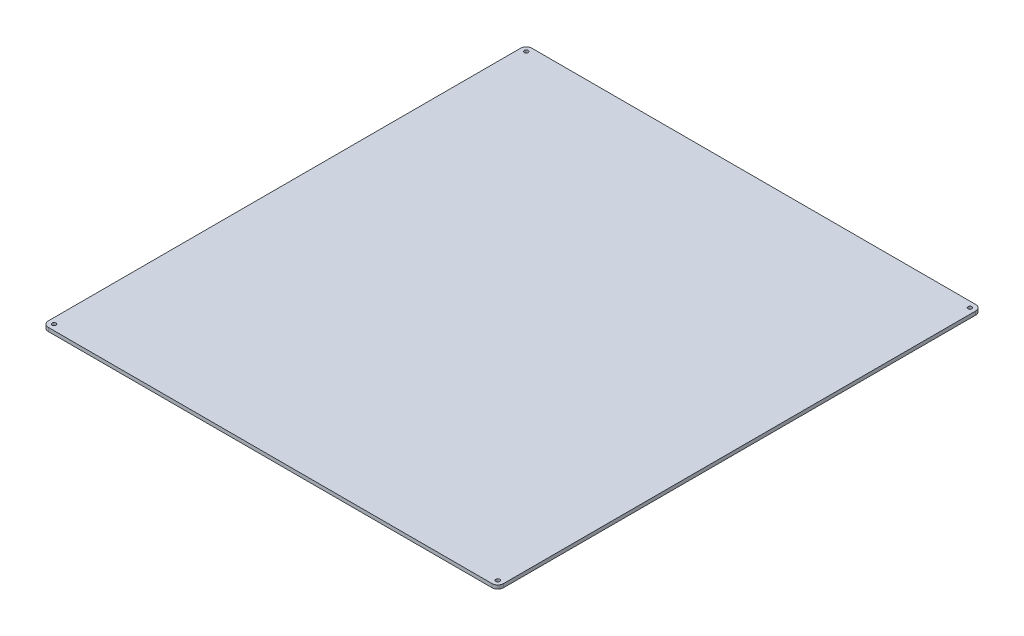
ISO-10303-21;
HEADER;
FILE_DESCRIPTION(('STEP AP214'),'2;1');
FILE_NAME('part.step','',(''),(''),'','','');
FILE_SCHEMA(('AUTOMOTIVE_DESIGN { 1 0 10303 214 1 1 1 1 }'));
ENDSEC;
DATA;
#1=APPLICATION_CONTEXT('core data for automotive mechanical design processes');
#2=APPLICATION_PROTOCOL_DEFINITION('international standard','automotive_design',2000,#1);
#3=PRODUCT_CONTEXT('',#1,'mechanical');
#4=PRODUCT('Part','Part','',(#3));
#5=PRODUCT_RELATED_PRODUCT_CATEGORY('part','',(#4));
#6=PRODUCT_DEFINITION_FORMATION('','',#4);
#7=PRODUCT_DEFINITION_CONTEXT('part definition',#1,'design');
#8=PRODUCT_DEFINITION('design','',#6,#7);
#9=PRODUCT_DEFINITION_SHAPE('','',#8);
#10=(LENGTH_UNIT() NAMED_UNIT(*) SI_UNIT(.MILLI.,.METRE.));
#11=(NAMED_UNIT(*) PLANE_ANGLE_UNIT() SI_UNIT($,.RADIAN.));
#12=(NAMED_UNIT(*) SI_UNIT($,.STERADIAN.) SOLID_ANGLE_UNIT());
#13=UNCERTAINTY_MEASURE_WITH_UNIT(LENGTH_MEASURE(1.E-05),#10,'distance_accuracy_value','');
#14=(GEOMETRIC_REPRESENTATION_CONTEXT(3) GLOBAL_UNCERTAINTY_ASSIGNED_CONTEXT((#13)) GLOBAL_UNIT_ASSIGNED_CONTEXT((#10,
#11,#12)) REPRESENTATION_CONTEXT('',''));
#15=CARTESIAN_POINT('',(0.,0.,0.));
#16=DIRECTION('',(0.,0.,1.));
#17=DIRECTION('',(1.,0.,0.));
#18=AXIS2_PLACEMENT_3D('',#15,#16,#17);
#19=CARTESIAN_POINT('',(0.,3.175,0.));
#20=DIRECTION('',(1.,0.,0.));
#21=DIRECTION('',(0.,0.,-1.));
#22=AXIS2_PLACEMENT_3D('',#19,#20,#21);
#23=PLANE('',#22);
#24=DIRECTION('',(0.,0.,1.));
#25=VECTOR('',#24,1.);
#26=CARTESIAN_POINT('',(0.,0.,0.));
#27=LINE('',#26,#25);
#28=CARTESIAN_POINT('',(0.,0.,-420.));
#29=VERTEX_POINT('',#28);
#30=CARTESIAN_POINT('',(0.,0.,-5.));
#31=VERTEX_POINT('',#30);
#32=EDGE_CURVE('E125',#29,#31,#27,.T.);
#33=ORIENTED_EDGE('',*,*,#32,.T.);
#34=DIRECTION('',(0.,-1.,0.));
#35=VECTOR('',#34,1.);
#36=CARTESIAN_POINT('',(0.,3.175,-5.));
#37=LINE('',#36,#35);
#38=CARTESIAN_POINT('',(0.,3.175,-5.));
#39=VERTEX_POINT('',#38);
#40=EDGE_CURVE('E103',#31,#39,#37,.F.);
#41=ORIENTED_EDGE('',*,*,#40,.T.);
#42=DIRECTION('',(0.,0.,1.));
#43=VECTOR('',#42,1.);
#44=CARTESIAN_POINT('',(0.,3.175,0.));
#45=LINE('',#44,#43);
#46=CARTESIAN_POINT('',(0.,3.175,-420.));
#47=VERTEX_POINT('',#46);
#48=EDGE_CURVE('E135',#47,#39,#45,.T.);
#49=ORIENTED_EDGE('',*,*,#48,.F.);
#50=DIRECTION('',(0.,-1.,0.));
#51=VECTOR('',#50,1.);
#52=CARTESIAN_POINT('',(0.,3.175,-420.));
#53=LINE('',#52,#51);
#54=EDGE_CURVE('E108',#47,#29,#53,.T.);
#55=ORIENTED_EDGE('',*,*,#54,.T.);
#56=EDGE_LOOP('',(#33,#41,#49,#55));
#57=FACE_BOUND('',#56,.T.);
#58=ADVANCED_FACE('F33',(#57),#23,.F.);
#59=CARTESIAN_POINT('',(0.,3.175,0.));
#60=DIRECTION('',(0.,0.,-1.));
#61=DIRECTION('',(-1.,0.,0.));
#62=AXIS2_PLACEMENT_3D('',#59,#60,#61);
#63=PLANE('',#62);
#64=DIRECTION('',(1.,0.,0.));
#65=VECTOR('',#64,1.);
#66=CARTESIAN_POINT('',(0.,3.175,0.));
#67=LINE('',#66,#65);
#68=CARTESIAN_POINT('',(5.,3.175,0.));
#69=VERTEX_POINT('',#68);
#70=CARTESIAN_POINT('',(395.,3.175,0.));
#71=VERTEX_POINT('',#70);
#72=EDGE_CURVE('E118',#69,#71,#67,.T.);
#73=ORIENTED_EDGE('',*,*,#72,.F.);
#74=DIRECTION('',(0.,-1.,0.));
#75=VECTOR('',#74,1.);
#76=CARTESIAN_POINT('',(5.,3.175,0.));
#77=LINE('',#76,#75);
#78=CARTESIAN_POINT('',(5.,0.,0.));
#79=VERTEX_POINT('',#78);
#80=EDGE_CURVE('E102',#69,#79,#77,.T.);
#81=ORIENTED_EDGE('',*,*,#80,.T.);
#82=DIRECTION('',(1.,0.,0.));
#83=VECTOR('',#82,1.);
#84=CARTESIAN_POINT('',(0.,0.,0.));
#85=LINE('',#84,#83);
#86=CARTESIAN_POINT('',(395.,0.,0.));
#87=VERTEX_POINT('',#86);
#88=EDGE_CURVE('E115',#79,#87,#85,.T.);
#89=ORIENTED_EDGE('',*,*,#88,.T.);
#90=DIRECTION('',(0.,-1.,0.));
#91=VECTOR('',#90,1.);
#92=CARTESIAN_POINT('',(395.,3.175,0.));
#93=LINE('',#92,#91);
#94=EDGE_CURVE('E120',#87,#71,#93,.F.);
#95=ORIENTED_EDGE('',*,*,#94,.T.);
#96=EDGE_LOOP('',(#73,#81,#89,#95));
#97=FACE_BOUND('',#96,.T.);
#98=ADVANCED_FACE('F114',(#97),#63,.F.);
#99=CARTESIAN_POINT('',(400.,3.175,0.));
#100=DIRECTION('',(-1.,0.,0.));
#101=DIRECTION('',(0.,0.,1.));
#102=AXIS2_PLACEMENT_3D('',#99,#100,#101);
#103=PLANE('',#102);
#104=DIRECTION('',(0.,0.,-1.));
#105=VECTOR('',#104,1.);
#106=CARTESIAN_POINT('',(400.,3.175,0.));
#107=LINE('',#106,#105);
#108=CARTESIAN_POINT('',(400.,3.175,-5.));
#109=VERTEX_POINT('',#108);
#110=CARTESIAN_POINT('',(400.,3.175,-420.));
#111=VERTEX_POINT('',#110);
#112=EDGE_CURVE('E169',#109,#111,#107,.T.);
#113=ORIENTED_EDGE('',*,*,#112,.F.);
#114=DIRECTION('',(0.,-1.,0.));
#115=VECTOR('',#114,1.);
#116=CARTESIAN_POINT('',(400.,3.175,-5.));
#117=LINE('',#116,#115);
#118=CARTESIAN_POINT('',(400.,0.,-5.));
#119=VERTEX_POINT('',#118);
#120=EDGE_CURVE('E154',#109,#119,#117,.T.);
#121=ORIENTED_EDGE('',*,*,#120,.T.);
#122=DIRECTION('',(0.,0.,-1.));
#123=VECTOR('',#122,1.);
#124=CARTESIAN_POINT('',(400.,0.,0.));
#125=LINE('',#124,#123);
#126=CARTESIAN_POINT('',(400.,0.,-420.));
#127=VERTEX_POINT('',#126);
#128=EDGE_CURVE('E124',#119,#127,#125,.T.);
#129=ORIENTED_EDGE('',*,*,#128,.T.);
#130=DIRECTION('',(0.,-1.,0.));
#131=VECTOR('',#130,1.);
#132=CARTESIAN_POINT('',(400.,3.175,-420.));
#133=LINE('',#132,#131);
#134=EDGE_CURVE('E152',#127,#111,#133,.F.);
#135=ORIENTED_EDGE('',*,*,#134,.T.);
#136=EDGE_LOOP('',(#113,#121,#129,#135));
#137=FACE_BOUND('',#136,.T.);
#138=ADVANCED_FACE('F185',(#137),#103,.F.);
#139=CARTESIAN_POINT('',(0.,3.175,-425.));
#140=DIRECTION('',(0.,0.,1.));
#141=DIRECTION('',(1.,0.,0.));
#142=AXIS2_PLACEMENT_3D('',#139,#140,#141);
#143=PLANE('',#142);
#144=DIRECTION('',(-1.,0.,0.));
#145=VECTOR('',#144,1.);
#146=CARTESIAN_POINT('',(0.,0.,-425.));
#147=LINE('',#146,#145);
#148=CARTESIAN_POINT('',(395.,0.,-425.));
#149=VERTEX_POINT('',#148);
#150=CARTESIAN_POINT('',(5.,0.,-425.));
#151=VERTEX_POINT('',#150);
#152=EDGE_CURVE('E128',#149,#151,#147,.T.);
#153=ORIENTED_EDGE('',*,*,#152,.T.);
#154=DIRECTION('',(0.,-1.,0.));
#155=VECTOR('',#154,1.);
#156=CARTESIAN_POINT('',(5.,3.175,-425.));
#157=LINE('',#156,#155);
#158=CARTESIAN_POINT('',(5.,3.175,-425.));
#159=VERTEX_POINT('',#158);
#160=EDGE_CURVE('E11',#151,#159,#157,.F.);
#161=ORIENTED_EDGE('',*,*,#160,.T.);
#162=DIRECTION('',(-1.,0.,0.));
#163=VECTOR('',#162,1.);
#164=CARTESIAN_POINT('',(0.,3.175,-425.));
#165=LINE('',#164,#163);
#166=CARTESIAN_POINT('',(395.,3.175,-425.));
#167=VERTEX_POINT('',#166);
#168=EDGE_CURVE('E136',#167,#159,#165,.T.);
#169=ORIENTED_EDGE('',*,*,#168,.F.);
#170=DIRECTION('',(0.,-1.,0.));
#171=VECTOR('',#170,1.);
#172=CARTESIAN_POINT('',(395.,3.175,-425.));
#173=LINE('',#172,#171);
#174=EDGE_CURVE('E41',#167,#149,#173,.T.);
#175=ORIENTED_EDGE('',*,*,#174,.T.);
#176=EDGE_LOOP('',(#153,#161,#169,#175));
#177=FACE_BOUND('',#176,.T.);
#178=ADVANCED_FACE('F159',(#177),#143,.F.);
#179=CARTESIAN_POINT('',(0.,3.175,0.));
#180=DIRECTION('',(0.,-1.,0.));
#181=DIRECTION('',(0.,0.,-1.));
#182=AXIS2_PLACEMENT_3D('',#179,#180,#181);
#183=PLANE('',#182);
#184=CARTESIAN_POINT('',(5.,3.175,-420.));
#185=DIRECTION('',(0.,1.,0.));
#186=DIRECTION('',(0.,0.,1.));
#187=AXIS2_PLACEMENT_3D('',#184,#185,#186);
#188=CIRCLE('',#187,1.69999999999999);
#189=CARTESIAN_POINT('',(5.,3.175,-418.3));
#190=VERTEX_POINT('',#189);
#191=EDGE_CURVE('E318',#190,#190,#188,.T.);
#192=ORIENTED_EDGE('',*,*,#191,.F.);
#193=EDGE_LOOP('',(#192));
#194=FACE_BOUND('',#193,.T.);
#195=CARTESIAN_POINT('',(395.,3.175,-420.));
#196=DIRECTION('',(0.,1.,0.));
#197=DIRECTION('',(0.,0.,1.));
#198=AXIS2_PLACEMENT_3D('',#195,#196,#197);
#199=CIRCLE('',#198,1.69999999999998);
#200=CARTESIAN_POINT('',(395.,3.175,-418.3));
#201=VERTEX_POINT('',#200);
#202=EDGE_CURVE('E312',#201,#201,#199,.T.);
#203=ORIENTED_EDGE('',*,*,#202,.F.);
#204=EDGE_LOOP('',(#203));
#205=FACE_BOUND('',#204,.T.);
#206=CARTESIAN_POINT('',(5.,3.175,-5.));
#207=DIRECTION('',(0.,1.,0.));
#208=DIRECTION('',(0.,0.,1.));
#209=AXIS2_PLACEMENT_3D('',#206,#207,#208);
#210=CIRCLE('',#209,1.69999999999999);
#211=CARTESIAN_POINT('',(5.,3.175,-3.30000000000002));
#212=VERTEX_POINT('',#211);
#213=EDGE_CURVE('E304',#212,#212,#210,.T.);
#214=ORIENTED_EDGE('',*,*,#213,.F.);
#215=EDGE_LOOP('',(#214));
#216=FACE_BOUND('',#215,.T.);
#217=CARTESIAN_POINT('',(395.,3.175,-5.));
#218=DIRECTION('',(0.,1.,0.));
#219=DIRECTION('',(0.,0.,1.));
#220=AXIS2_PLACEMENT_3D('',#217,#218,#219);
#221=CIRCLE('',#220,1.69999999999998);
#222=CARTESIAN_POINT('',(395.,3.175,-3.30000000000003));
#223=VERTEX_POINT('',#222);
#224=EDGE_CURVE('E300',#223,#223,#221,.T.);
#225=ORIENTED_EDGE('',*,*,#224,.F.);
#226=EDGE_LOOP('',(#225));
#227=FACE_BOUND('',#226,.T.);
#228=ORIENTED_EDGE('',*,*,#48,.T.);
#229=CARTESIAN_POINT('',(5.,3.175,-5.));
#230=DIRECTION('',(0.,-1.,0.));
#231=DIRECTION('',(0.,0.,-1.));
#232=AXIS2_PLACEMENT_3D('',#229,#230,#231);
#233=CIRCLE('',#232,5.);
#234=EDGE_CURVE('E150',#39,#69,#233,.F.);
#235=ORIENTED_EDGE('',*,*,#234,.T.);
#236=ORIENTED_EDGE('',*,*,#72,.T.);
#237=CARTESIAN_POINT('',(395.,3.175,-5.));
#238=DIRECTION('',(0.,-1.,0.));
#239=DIRECTION('',(0.,0.,-1.));
#240=AXIS2_PLACEMENT_3D('',#237,#238,#239);
#241=CIRCLE('',#240,5.);
#242=EDGE_CURVE('E148',#71,#109,#241,.F.);
#243=ORIENTED_EDGE('',*,*,#242,.T.);
#244=ORIENTED_EDGE('',*,*,#112,.T.);
#245=CARTESIAN_POINT('',(395.,3.175,-420.));
#246=DIRECTION('',(0.,-1.,0.));
#247=DIRECTION('',(0.,0.,-1.));
#248=AXIS2_PLACEMENT_3D('',#245,#246,#247);
#249=CIRCLE('',#248,5.);
#250=EDGE_CURVE('E53',#111,#167,#249,.F.);
#251=ORIENTED_EDGE('',*,*,#250,.T.);
#252=ORIENTED_EDGE('',*,*,#168,.T.);
#253=CARTESIAN_POINT('',(5.,3.175,-420.));
#254=DIRECTION('',(0.,-1.,0.));
#255=DIRECTION('',(0.,0.,-1.));
#256=AXIS2_PLACEMENT_3D('',#253,#254,#255);
#257=CIRCLE('',#256,5.);
#258=EDGE_CURVE('E146',#159,#47,#257,.F.);
#259=ORIENTED_EDGE('',*,*,#258,.T.);
#260=EDGE_LOOP('',(#228,#235,#236,#243,#244,#251,#252,#259));
#261=FACE_BOUND('',#260,.T.);
#262=ADVANCED_FACE('F174',(#194,#205,#216,#227,#261),#183,.F.);
#263=CARTESIAN_POINT('',(0.,0.,0.));
#264=DIRECTION('',(0.,-1.,0.));
#265=DIRECTION('',(0.,0.,-1.));
#266=AXIS2_PLACEMENT_3D('',#263,#264,#265);
#267=PLANE('',#266);
#268=CARTESIAN_POINT('',(5.,0.,-420.));
#269=DIRECTION('',(0.,1.,0.));
#270=DIRECTION('',(0.,0.,1.));
#271=AXIS2_PLACEMENT_3D('',#268,#269,#270);
#272=CIRCLE('',#271,1.7);
#273=CARTESIAN_POINT('',(5.,0.,-418.3));
#274=VERTEX_POINT('',#273);
#275=EDGE_CURVE('E315',#274,#274,#272,.T.);
#276=ORIENTED_EDGE('',*,*,#275,.T.);
#277=EDGE_LOOP('',(#276));
#278=FACE_BOUND('',#277,.T.);
#279=CARTESIAN_POINT('',(395.,0.,-420.));
#280=DIRECTION('',(0.,1.,0.));
#281=DIRECTION('',(0.,0.,1.));
#282=AXIS2_PLACEMENT_3D('',#279,#280,#281);
#283=CIRCLE('',#282,1.69999999999998);
#284=CARTESIAN_POINT('',(395.,0.,-418.3));
#285=VERTEX_POINT('',#284);
#286=EDGE_CURVE('E309',#285,#285,#283,.T.);
#287=ORIENTED_EDGE('',*,*,#286,.T.);
#288=EDGE_LOOP('',(#287));
#289=FACE_BOUND('',#288,.T.);
#290=CARTESIAN_POINT('',(5.,0.,-5.));
#291=DIRECTION('',(0.,1.,0.));
#292=DIRECTION('',(0.,0.,1.));
#293=AXIS2_PLACEMENT_3D('',#290,#291,#292);
#294=CIRCLE('',#293,1.7);
#295=CARTESIAN_POINT('',(5.,0.,-3.30000000000001));
#296=VERTEX_POINT('',#295);
#297=EDGE_CURVE('E302',#296,#296,#294,.T.);
#298=ORIENTED_EDGE('',*,*,#297,.T.);
#299=EDGE_LOOP('',(#298));
#300=FACE_BOUND('',#299,.T.);
#301=CARTESIAN_POINT('',(395.,0.,-5.));
#302=DIRECTION('',(0.,1.,0.));
#303=DIRECTION('',(0.,0.,1.));
#304=AXIS2_PLACEMENT_3D('',#301,#302,#303);
#305=CIRCLE('',#304,1.69999999999998);
#306=CARTESIAN_POINT('',(395.,0.,-3.30000000000003));
#307=VERTEX_POINT('',#306);
#308=EDGE_CURVE('E130',#307,#307,#305,.T.);
#309=ORIENTED_EDGE('',*,*,#308,.T.);
#310=EDGE_LOOP('',(#309));
#311=FACE_BOUND('',#310,.T.);
#312=ORIENTED_EDGE('',*,*,#88,.F.);
#313=CARTESIAN_POINT('',(5.,0.,-5.));
#314=DIRECTION('',(0.,-1.,0.));
#315=DIRECTION('',(0.,0.,-1.));
#316=AXIS2_PLACEMENT_3D('',#313,#314,#315);
#317=CIRCLE('',#316,5.);
#318=EDGE_CURVE('E98',#79,#31,#317,.T.);
#319=ORIENTED_EDGE('',*,*,#318,.T.);
#320=ORIENTED_EDGE('',*,*,#32,.F.);
#321=CARTESIAN_POINT('',(5.,0.,-420.));
#322=DIRECTION('',(0.,-1.,0.));
#323=DIRECTION('',(0.,0.,-1.));
#324=AXIS2_PLACEMENT_3D('',#321,#322,#323);
#325=CIRCLE('',#324,5.);
#326=EDGE_CURVE('E139',#29,#151,#325,.T.);
#327=ORIENTED_EDGE('',*,*,#326,.T.);
#328=ORIENTED_EDGE('',*,*,#152,.F.);
#329=CARTESIAN_POINT('',(395.,0.,-420.));
#330=DIRECTION('',(0.,-1.,0.));
#331=DIRECTION('',(0.,0.,-1.));
#332=AXIS2_PLACEMENT_3D('',#329,#330,#331);
#333=CIRCLE('',#332,5.);
#334=EDGE_CURVE('E119',#149,#127,#333,.T.);
#335=ORIENTED_EDGE('',*,*,#334,.T.);
#336=ORIENTED_EDGE('',*,*,#128,.F.);
#337=CARTESIAN_POINT('',(395.,0.,-5.));
#338=DIRECTION('',(0.,-1.,0.));
#339=DIRECTION('',(0.,0.,-1.));
#340=AXIS2_PLACEMENT_3D('',#337,#338,#339);
#341=CIRCLE('',#340,5.);
#342=EDGE_CURVE('E109',#119,#87,#341,.T.);
#343=ORIENTED_EDGE('',*,*,#342,.T.);
#344=EDGE_LOOP('',(#312,#319,#320,#327,#328,#335,#336,#343));
#345=FACE_BOUND('',#344,.T.);
#346=ADVANCED_FACE('F122',(#278,#289,#300,#311,#345),#267,.T.);
#347=CARTESIAN_POINT('',(395.,3.175,-5.));
#348=DIRECTION('',(0.,1.,0.));
#349=DIRECTION('',(0.,0.,1.));
#350=AXIS2_PLACEMENT_3D('',#347,#348,#349);
#351=CYLINDRICAL_SURFACE('',#350,1.69999999999998);
#352=ORIENTED_EDGE('',*,*,#308,.F.);
#353=EDGE_LOOP('',(#352));
#354=FACE_BOUND('',#353,.T.);
#355=ORIENTED_EDGE('',*,*,#224,.T.);
#356=EDGE_LOOP('',(#355));
#357=FACE_BOUND('',#356,.T.);
#358=ADVANCED_FACE('F182',(#354,#357),#351,.F.);
#359=CARTESIAN_POINT('',(5.,3.175,-5.));
#360=DIRECTION('',(0.,1.,0.));
#361=DIRECTION('',(0.,0.,1.));
#362=AXIS2_PLACEMENT_3D('',#359,#360,#361);
#363=CYLINDRICAL_SURFACE('',#362,1.69999999999999);
#364=ORIENTED_EDGE('',*,*,#297,.F.);
#365=EDGE_LOOP('',(#364));
#366=FACE_BOUND('',#365,.T.);
#367=ORIENTED_EDGE('',*,*,#213,.T.);
#368=EDGE_LOOP('',(#367));
#369=FACE_BOUND('',#368,.T.);
#370=ADVANCED_FACE('F272',(#366,#369),#363,.F.);
#371=CARTESIAN_POINT('',(395.,3.175,-420.));
#372=DIRECTION('',(0.,1.,0.));
#373=DIRECTION('',(0.,0.,1.));
#374=AXIS2_PLACEMENT_3D('',#371,#372,#373);
#375=CYLINDRICAL_SURFACE('',#374,1.69999999999998);
#376=ORIENTED_EDGE('',*,*,#286,.F.);
#377=EDGE_LOOP('',(#376));
#378=FACE_BOUND('',#377,.T.);
#379=ORIENTED_EDGE('',*,*,#202,.T.);
#380=EDGE_LOOP('',(#379));
#381=FACE_BOUND('',#380,.T.);
#382=ADVANCED_FACE('F265',(#378,#381),#375,.F.);
#383=CARTESIAN_POINT('',(5.,3.175,-420.));
#384=DIRECTION('',(0.,1.,0.));
#385=DIRECTION('',(0.,0.,1.));
#386=AXIS2_PLACEMENT_3D('',#383,#384,#385);
#387=CYLINDRICAL_SURFACE('',#386,1.69999999999999);
#388=ORIENTED_EDGE('',*,*,#275,.F.);
#389=EDGE_LOOP('',(#388));
#390=FACE_BOUND('',#389,.T.);
#391=ORIENTED_EDGE('',*,*,#191,.T.);
#392=EDGE_LOOP('',(#391));
#393=FACE_BOUND('',#392,.T.);
#394=ADVANCED_FACE('F201',(#390,#393),#387,.F.);
#395=CARTESIAN_POINT('',(5.,3.175,-5.));
#396=DIRECTION('',(0.,-1.,0.));
#397=DIRECTION('',(0.,0.,-1.));
#398=AXIS2_PLACEMENT_3D('',#395,#396,#397);
#399=CYLINDRICAL_SURFACE('',#398,5.);
#400=ORIENTED_EDGE('',*,*,#234,.F.);
#401=ORIENTED_EDGE('',*,*,#40,.F.);
#402=ORIENTED_EDGE('',*,*,#318,.F.);
#403=ORIENTED_EDGE('',*,*,#80,.F.);
#404=EDGE_LOOP('',(#400,#401,#402,#403));
#405=FACE_BOUND('',#404,.T.);
#406=ADVANCED_FACE('F101',(#405),#399,.T.);
#407=CARTESIAN_POINT('',(395.,3.175,-5.));
#408=DIRECTION('',(0.,-1.,0.));
#409=DIRECTION('',(0.,0.,-1.));
#410=AXIS2_PLACEMENT_3D('',#407,#408,#409);
#411=CYLINDRICAL_SURFACE('',#410,5.);
#412=ORIENTED_EDGE('',*,*,#242,.F.);
#413=ORIENTED_EDGE('',*,*,#94,.F.);
#414=ORIENTED_EDGE('',*,*,#342,.F.);
#415=ORIENTED_EDGE('',*,*,#120,.F.);
#416=EDGE_LOOP('',(#412,#413,#414,#415));
#417=FACE_BOUND('',#416,.T.);
#418=ADVANCED_FACE('F200',(#417),#411,.T.);
#419=CARTESIAN_POINT('',(5.,3.175,-420.));
#420=DIRECTION('',(0.,-1.,0.));
#421=DIRECTION('',(0.,0.,-1.));
#422=AXIS2_PLACEMENT_3D('',#419,#420,#421);
#423=CYLINDRICAL_SURFACE('',#422,5.);
#424=ORIENTED_EDGE('',*,*,#258,.F.);
#425=ORIENTED_EDGE('',*,*,#160,.F.);
#426=ORIENTED_EDGE('',*,*,#326,.F.);
#427=ORIENTED_EDGE('',*,*,#54,.F.);
#428=EDGE_LOOP('',(#424,#425,#426,#427));
#429=FACE_BOUND('',#428,.T.);
#430=ADVANCED_FACE('F164',(#429),#423,.T.);
#431=CARTESIAN_POINT('',(395.,3.175,-420.));
#432=DIRECTION('',(0.,-1.,0.));
#433=DIRECTION('',(0.,0.,-1.));
#434=AXIS2_PLACEMENT_3D('',#431,#432,#433);
#435=CYLINDRICAL_SURFACE('',#434,5.);
#436=ORIENTED_EDGE('',*,*,#250,.F.);
#437=ORIENTED_EDGE('',*,*,#134,.F.);
#438=ORIENTED_EDGE('',*,*,#334,.F.);
#439=ORIENTED_EDGE('',*,*,#174,.F.);
#440=EDGE_LOOP('',(#436,#437,#438,#439));
#441=FACE_BOUND('',#440,.T.);
#442=ADVANCED_FACE('F35',(#441),#435,.T.);
#443=CLOSED_SHELL('',(#58,#98,#138,#178,#262,#346,#358,#370,#382,#394,#406,#418,#430,#442));
#444=MANIFOLD_SOLID_BREP('B2',#443);
#445=ADVANCED_BREP_SHAPE_REPRESENTATION('',(#18,#444),#14);
#446=SHAPE_DEFINITION_REPRESENTATION(#9,#445);
ENDSEC;
END-ISO-10303-21;
